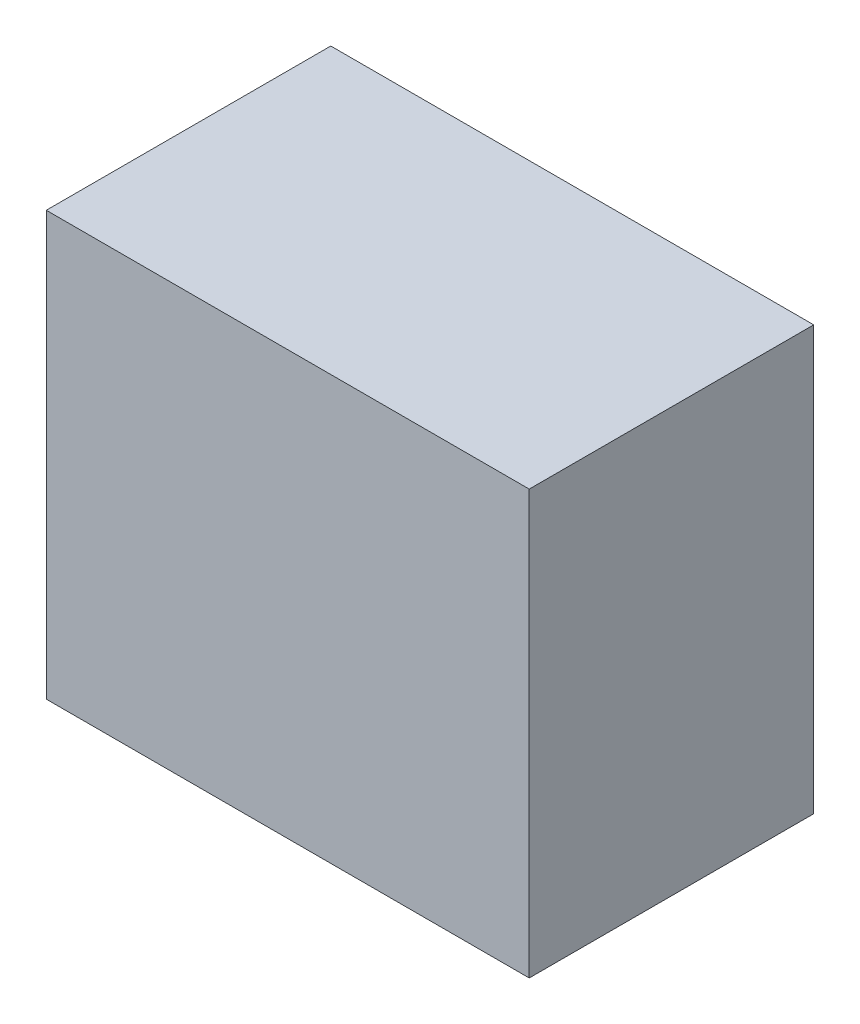
ISO-10303-21;
HEADER;
FILE_DESCRIPTION(('STEP AP214'),'2;1');
FILE_NAME('part.step','',(''),(''),'','','');
FILE_SCHEMA(('AUTOMOTIVE_DESIGN { 1 0 10303 214 1 1 1 1 }'));
ENDSEC;
DATA;
#1=APPLICATION_CONTEXT('core data for automotive mechanical design processes');
#2=APPLICATION_PROTOCOL_DEFINITION('international standard','automotive_design',2000,#1);
#3=PRODUCT_CONTEXT('',#1,'mechanical');
#4=PRODUCT('Part','Part','',(#3));
#5=PRODUCT_RELATED_PRODUCT_CATEGORY('part','',(#4));
#6=PRODUCT_DEFINITION_FORMATION('','',#4);
#7=PRODUCT_DEFINITION_CONTEXT('part definition',#1,'design');
#8=PRODUCT_DEFINITION('design','',#6,#7);
#9=PRODUCT_DEFINITION_SHAPE('','',#8);
#10=(LENGTH_UNIT() NAMED_UNIT(*) SI_UNIT(.MILLI.,.METRE.));
#11=(NAMED_UNIT(*) PLANE_ANGLE_UNIT() SI_UNIT($,.RADIAN.));
#12=(NAMED_UNIT(*) SI_UNIT($,.STERADIAN.) SOLID_ANGLE_UNIT());
#13=UNCERTAINTY_MEASURE_WITH_UNIT(LENGTH_MEASURE(1.E-05),#10,'distance_accuracy_value','');
#14=(GEOMETRIC_REPRESENTATION_CONTEXT(3) GLOBAL_UNCERTAINTY_ASSIGNED_CONTEXT((#13)) GLOBAL_UNIT_ASSIGNED_CONTEXT((#10,
#11,#12)) REPRESENTATION_CONTEXT('',''));
#15=CARTESIAN_POINT('',(0.,0.,0.));
#16=DIRECTION('',(0.,0.,1.));
#17=DIRECTION('',(1.,0.,0.));
#18=AXIS2_PLACEMENT_3D('',#15,#16,#17);
#19=CARTESIAN_POINT('',(36.5,32.,43.));
#20=DIRECTION('',(-1.,0.,0.));
#21=DIRECTION('',(0.,0.,1.));
#22=AXIS2_PLACEMENT_3D('',#19,#20,#21);
#23=PLANE('',#22);
#24=DIRECTION('',(0.,1.,0.));
#25=VECTOR('',#24,1.);
#26=CARTESIAN_POINT('',(36.5,32.,0.));
#27=LINE('',#26,#25);
#28=CARTESIAN_POINT('',(36.5,-32.,0.));
#29=VERTEX_POINT('',#28);
#30=CARTESIAN_POINT('',(36.5,32.,0.));
#31=VERTEX_POINT('',#30);
#32=EDGE_CURVE('E104',#29,#31,#27,.T.);
#33=ORIENTED_EDGE('',*,*,#32,.T.);
#34=DIRECTION('',(0.,0.,-1.));
#35=VECTOR('',#34,1.);
#36=CARTESIAN_POINT('',(36.5,32.,43.));
#37=LINE('',#36,#35);
#38=CARTESIAN_POINT('',(36.5,32.,43.));
#39=VERTEX_POINT('',#38);
#40=EDGE_CURVE('E11',#39,#31,#37,.T.);
#41=ORIENTED_EDGE('',*,*,#40,.F.);
#42=DIRECTION('',(0.,1.,0.));
#43=VECTOR('',#42,1.);
#44=CARTESIAN_POINT('',(36.5,32.,43.));
#45=LINE('',#44,#43);
#46=CARTESIAN_POINT('',(36.5,-32.,43.));
#47=VERTEX_POINT('',#46);
#48=EDGE_CURVE('E92',#47,#39,#45,.T.);
#49=ORIENTED_EDGE('',*,*,#48,.F.);
#50=DIRECTION('',(0.,0.,-1.));
#51=VECTOR('',#50,1.);
#52=CARTESIAN_POINT('',(36.5,-32.,43.));
#53=LINE('',#52,#51);
#54=EDGE_CURVE('E100',#47,#29,#53,.T.);
#55=ORIENTED_EDGE('',*,*,#54,.T.);
#56=EDGE_LOOP('',(#33,#41,#49,#55));
#57=FACE_BOUND('',#56,.T.);
#58=ADVANCED_FACE('F41',(#57),#23,.F.);
#59=CARTESIAN_POINT('',(-36.5,32.,43.));
#60=DIRECTION('',(0.,-1.,0.));
#61=DIRECTION('',(0.,0.,-1.));
#62=AXIS2_PLACEMENT_3D('',#59,#60,#61);
#63=PLANE('',#62);
#64=DIRECTION('',(-1.,0.,0.));
#65=VECTOR('',#64,1.);
#66=CARTESIAN_POINT('',(-36.5,32.,0.));
#67=LINE('',#66,#65);
#68=CARTESIAN_POINT('',(-36.5,32.,0.));
#69=VERTEX_POINT('',#68);
#70=EDGE_CURVE('E96',#31,#69,#67,.T.);
#71=ORIENTED_EDGE('',*,*,#70,.T.);
#72=DIRECTION('',(0.,0.,-1.));
#73=VECTOR('',#72,1.);
#74=CARTESIAN_POINT('',(-36.5,32.,43.));
#75=LINE('',#74,#73);
#76=CARTESIAN_POINT('',(-36.5,32.,43.));
#77=VERTEX_POINT('',#76);
#78=EDGE_CURVE('E49',#77,#69,#75,.T.);
#79=ORIENTED_EDGE('',*,*,#78,.F.);
#80=DIRECTION('',(-1.,0.,0.));
#81=VECTOR('',#80,1.);
#82=CARTESIAN_POINT('',(-36.5,32.,43.));
#83=LINE('',#82,#81);
#84=EDGE_CURVE('E87',#39,#77,#83,.T.);
#85=ORIENTED_EDGE('',*,*,#84,.F.);
#86=ORIENTED_EDGE('',*,*,#40,.T.);
#87=EDGE_LOOP('',(#71,#79,#85,#86));
#88=FACE_BOUND('',#87,.T.);
#89=ADVANCED_FACE('F95',(#88),#63,.F.);
#90=CARTESIAN_POINT('',(-36.5,32.,43.));
#91=DIRECTION('',(1.,0.,0.));
#92=DIRECTION('',(0.,0.,-1.));
#93=AXIS2_PLACEMENT_3D('',#90,#91,#92);
#94=PLANE('',#93);
#95=DIRECTION('',(0.,-1.,0.));
#96=VECTOR('',#95,1.);
#97=CARTESIAN_POINT('',(-36.5,32.,0.));
#98=LINE('',#97,#96);
#99=CARTESIAN_POINT('',(-36.5,-32.,0.));
#100=VERTEX_POINT('',#99);
#101=EDGE_CURVE('E74',#69,#100,#98,.T.);
#102=ORIENTED_EDGE('',*,*,#101,.T.);
#103=DIRECTION('',(0.,0.,-1.));
#104=VECTOR('',#103,1.);
#105=CARTESIAN_POINT('',(-36.5,-32.,43.));
#106=LINE('',#105,#104);
#107=CARTESIAN_POINT('',(-36.5,-32.,43.));
#108=VERTEX_POINT('',#107);
#109=EDGE_CURVE('E97',#108,#100,#106,.T.);
#110=ORIENTED_EDGE('',*,*,#109,.F.);
#111=DIRECTION('',(0.,-1.,0.));
#112=VECTOR('',#111,1.);
#113=CARTESIAN_POINT('',(-36.5,32.,43.));
#114=LINE('',#113,#112);
#115=EDGE_CURVE('E90',#77,#108,#114,.T.);
#116=ORIENTED_EDGE('',*,*,#115,.F.);
#117=ORIENTED_EDGE('',*,*,#78,.T.);
#118=EDGE_LOOP('',(#102,#110,#116,#117));
#119=FACE_BOUND('',#118,.T.);
#120=ADVANCED_FACE('F98',(#119),#94,.F.);
#121=CARTESIAN_POINT('',(-36.5,-32.,43.));
#122=DIRECTION('',(0.,1.,0.));
#123=DIRECTION('',(0.,0.,1.));
#124=AXIS2_PLACEMENT_3D('',#121,#122,#123);
#125=PLANE('',#124);
#126=DIRECTION('',(1.,0.,0.));
#127=VECTOR('',#126,1.);
#128=CARTESIAN_POINT('',(-36.5,-32.,0.));
#129=LINE('',#128,#127);
#130=EDGE_CURVE('E80',#100,#29,#129,.T.);
#131=ORIENTED_EDGE('',*,*,#130,.T.);
#132=ORIENTED_EDGE('',*,*,#54,.F.);
#133=DIRECTION('',(1.,0.,0.));
#134=VECTOR('',#133,1.);
#135=CARTESIAN_POINT('',(-36.5,-32.,43.));
#136=LINE('',#135,#134);
#137=EDGE_CURVE('E57',#108,#47,#136,.T.);
#138=ORIENTED_EDGE('',*,*,#137,.F.);
#139=ORIENTED_EDGE('',*,*,#109,.T.);
#140=EDGE_LOOP('',(#131,#132,#138,#139));
#141=FACE_BOUND('',#140,.T.);
#142=ADVANCED_FACE('F111',(#141),#125,.F.);
#143=CARTESIAN_POINT('',(0.,0.,43.));
#144=DIRECTION('',(0.,0.,1.));
#145=DIRECTION('',(1.,0.,0.));
#146=AXIS2_PLACEMENT_3D('',#143,#144,#145);
#147=PLANE('',#146);
#148=ORIENTED_EDGE('',*,*,#48,.T.);
#149=ORIENTED_EDGE('',*,*,#84,.T.);
#150=ORIENTED_EDGE('',*,*,#115,.T.);
#151=ORIENTED_EDGE('',*,*,#137,.T.);
#152=EDGE_LOOP('',(#148,#149,#150,#151));
#153=FACE_BOUND('',#152,.T.);
#154=ADVANCED_FACE('F88',(#153),#147,.T.);
#155=CARTESIAN_POINT('',(0.,0.,0.));
#156=DIRECTION('',(0.,0.,1.));
#157=DIRECTION('',(1.,0.,0.));
#158=AXIS2_PLACEMENT_3D('',#155,#156,#157);
#159=PLANE('',#158);
#160=ORIENTED_EDGE('',*,*,#32,.F.);
#161=ORIENTED_EDGE('',*,*,#130,.F.);
#162=ORIENTED_EDGE('',*,*,#101,.F.);
#163=ORIENTED_EDGE('',*,*,#70,.F.);
#164=EDGE_LOOP('',(#160,#161,#162,#163));
#165=FACE_BOUND('',#164,.T.);
#166=ADVANCED_FACE('F114',(#165),#159,.F.);
#167=CLOSED_SHELL('',(#58,#89,#120,#142,#154,#166));
#168=MANIFOLD_SOLID_BREP('B2',#167);
#169=ADVANCED_BREP_SHAPE_REPRESENTATION('',(#18,#168),#14);
#170=SHAPE_DEFINITION_REPRESENTATION(#9,#169);
ENDSEC;
END-ISO-10303-21;
